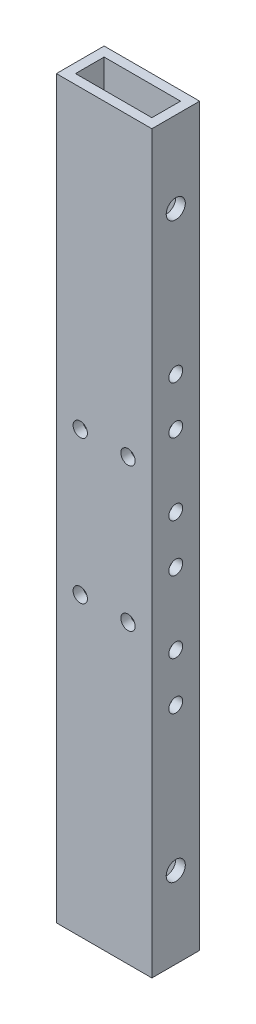
ISO-10303-21;
HEADER;
FILE_DESCRIPTION(('STEP AP214'),'2;1');
FILE_NAME('part.step','',(''),(''),'','','');
FILE_SCHEMA(('AUTOMOTIVE_DESIGN { 1 0 10303 214 1 1 1 1 }'));
ENDSEC;
DATA;
#1=APPLICATION_CONTEXT('core data for automotive mechanical design processes');
#2=APPLICATION_PROTOCOL_DEFINITION('international standard','automotive_design',2000,#1);
#3=PRODUCT_CONTEXT('',#1,'mechanical');
#4=PRODUCT('Part','Part','',(#3));
#5=PRODUCT_RELATED_PRODUCT_CATEGORY('part','',(#4));
#6=PRODUCT_DEFINITION_FORMATION('','',#4);
#7=PRODUCT_DEFINITION_CONTEXT('part definition',#1,'design');
#8=PRODUCT_DEFINITION('design','',#6,#7);
#9=PRODUCT_DEFINITION_SHAPE('','',#8);
#10=(LENGTH_UNIT() NAMED_UNIT(*) SI_UNIT(.MILLI.,.METRE.));
#11=(NAMED_UNIT(*) PLANE_ANGLE_UNIT() SI_UNIT($,.RADIAN.));
#12=(NAMED_UNIT(*) SI_UNIT($,.STERADIAN.) SOLID_ANGLE_UNIT());
#13=UNCERTAINTY_MEASURE_WITH_UNIT(LENGTH_MEASURE(1.E-05),#10,'distance_accuracy_value','');
#14=(GEOMETRIC_REPRESENTATION_CONTEXT(3) GLOBAL_UNCERTAINTY_ASSIGNED_CONTEXT((#13)) GLOBAL_UNIT_ASSIGNED_CONTEXT((#10,
#11,#12)) REPRESENTATION_CONTEXT('',''));
#15=CARTESIAN_POINT('',(0.,0.,0.));
#16=DIRECTION('',(0.,0.,1.));
#17=DIRECTION('',(1.,0.,0.));
#18=AXIS2_PLACEMENT_3D('',#15,#16,#17);
#19=CARTESIAN_POINT('',(0.,77.,0.));
#20=DIRECTION('',(0.,1.,0.));
#21=DIRECTION('',(0.,0.,1.));
#22=AXIS2_PLACEMENT_3D('',#19,#20,#21);
#23=PLANE('',#22);
#24=DIRECTION('',(0.,0.,-1.));
#25=VECTOR('',#24,1.);
#26=CARTESIAN_POINT('',(10.,77.,-5.));
#27=LINE('',#26,#25);
#28=CARTESIAN_POINT('',(10.,77.,5.));
#29=VERTEX_POINT('',#28);
#30=CARTESIAN_POINT('',(10.,77.,-5.));
#31=VERTEX_POINT('',#30);
#32=EDGE_CURVE('E141',#29,#31,#27,.T.);
#33=ORIENTED_EDGE('',*,*,#32,.T.);
#34=DIRECTION('',(-1.,0.,0.));
#35=VECTOR('',#34,1.);
#36=CARTESIAN_POINT('',(-10.,77.,-5.));
#37=LINE('',#36,#35);
#38=CARTESIAN_POINT('',(-10.,77.,-5.));
#39=VERTEX_POINT('',#38);
#40=EDGE_CURVE('E144',#31,#39,#37,.T.);
#41=ORIENTED_EDGE('',*,*,#40,.T.);
#42=DIRECTION('',(0.,0.,1.));
#43=VECTOR('',#42,1.);
#44=CARTESIAN_POINT('',(-10.,77.,-5.));
#45=LINE('',#44,#43);
#46=CARTESIAN_POINT('',(-10.,77.,5.));
#47=VERTEX_POINT('',#46);
#48=EDGE_CURVE('E147',#39,#47,#45,.T.);
#49=ORIENTED_EDGE('',*,*,#48,.T.);
#50=DIRECTION('',(1.,0.,0.));
#51=VECTOR('',#50,1.);
#52=CARTESIAN_POINT('',(-10.,77.,5.));
#53=LINE('',#52,#51);
#54=EDGE_CURVE('E149',#47,#29,#53,.T.);
#55=ORIENTED_EDGE('',*,*,#54,.T.);
#56=EDGE_LOOP('',(#33,#41,#49,#55));
#57=FACE_BOUND('',#56,.T.);
#58=DIRECTION('',(-1.,0.,0.));
#59=VECTOR('',#58,1.);
#60=CARTESIAN_POINT('',(-8.,77.,-3.));
#61=LINE('',#60,#59);
#62=CARTESIAN_POINT('',(8.,77.,-3.));
#63=VERTEX_POINT('',#62);
#64=CARTESIAN_POINT('',(-8.,77.,-3.));
#65=VERTEX_POINT('',#64);
#66=EDGE_CURVE('E111',#63,#65,#61,.T.);
#67=ORIENTED_EDGE('',*,*,#66,.F.);
#68=DIRECTION('',(0.,0.,-1.));
#69=VECTOR('',#68,1.);
#70=CARTESIAN_POINT('',(8.,77.,-3.));
#71=LINE('',#70,#69);
#72=CARTESIAN_POINT('',(8.,77.,3.));
#73=VERTEX_POINT('',#72);
#74=EDGE_CURVE('E103',#73,#63,#71,.T.);
#75=ORIENTED_EDGE('',*,*,#74,.F.);
#76=DIRECTION('',(1.,0.,0.));
#77=VECTOR('',#76,1.);
#78=CARTESIAN_POINT('',(-8.,77.,3.));
#79=LINE('',#78,#77);
#80=CARTESIAN_POINT('',(-8.,77.,3.));
#81=VERTEX_POINT('',#80);
#82=EDGE_CURVE('E125',#81,#73,#79,.T.);
#83=ORIENTED_EDGE('',*,*,#82,.F.);
#84=DIRECTION('',(0.,0.,1.));
#85=VECTOR('',#84,1.);
#86=CARTESIAN_POINT('',(-8.,77.,-3.));
#87=LINE('',#86,#85);
#88=EDGE_CURVE('E123',#65,#81,#87,.T.);
#89=ORIENTED_EDGE('',*,*,#88,.F.);
#90=EDGE_LOOP('',(#67,#75,#83,#89));
#91=FACE_BOUND('',#90,.T.);
#92=ADVANCED_FACE('F36',(#57,#91),#23,.T.);
#93=CARTESIAN_POINT('',(0.,-77.,0.));
#94=DIRECTION('',(0.,1.,0.));
#95=DIRECTION('',(0.,0.,1.));
#96=AXIS2_PLACEMENT_3D('',#93,#94,#95);
#97=PLANE('',#96);
#98=DIRECTION('',(0.,0.,-1.));
#99=VECTOR('',#98,1.);
#100=CARTESIAN_POINT('',(10.,-77.,-5.));
#101=LINE('',#100,#99);
#102=CARTESIAN_POINT('',(10.,-77.,5.));
#103=VERTEX_POINT('',#102);
#104=CARTESIAN_POINT('',(10.,-77.,-5.));
#105=VERTEX_POINT('',#104);
#106=EDGE_CURVE('E119',#103,#105,#101,.T.);
#107=ORIENTED_EDGE('',*,*,#106,.F.);
#108=DIRECTION('',(1.,0.,0.));
#109=VECTOR('',#108,1.);
#110=CARTESIAN_POINT('',(-10.,-77.,5.));
#111=LINE('',#110,#109);
#112=CARTESIAN_POINT('',(-10.,-77.,5.));
#113=VERTEX_POINT('',#112);
#114=EDGE_CURVE('E145',#113,#103,#111,.T.);
#115=ORIENTED_EDGE('',*,*,#114,.F.);
#116=DIRECTION('',(0.,0.,1.));
#117=VECTOR('',#116,1.);
#118=CARTESIAN_POINT('',(-10.,-77.,-5.));
#119=LINE('',#118,#117);
#120=CARTESIAN_POINT('',(-10.,-77.,-5.));
#121=VERTEX_POINT('',#120);
#122=EDGE_CURVE('E156',#121,#113,#119,.T.);
#123=ORIENTED_EDGE('',*,*,#122,.F.);
#124=DIRECTION('',(-1.,0.,0.));
#125=VECTOR('',#124,1.);
#126=CARTESIAN_POINT('',(-10.,-77.,-5.));
#127=LINE('',#126,#125);
#128=EDGE_CURVE('E154',#105,#121,#127,.T.);
#129=ORIENTED_EDGE('',*,*,#128,.F.);
#130=EDGE_LOOP('',(#107,#115,#123,#129));
#131=FACE_BOUND('',#130,.T.);
#132=DIRECTION('',(0.,0.,-1.));
#133=VECTOR('',#132,1.);
#134=CARTESIAN_POINT('',(8.,-77.,-3.));
#135=LINE('',#134,#133);
#136=CARTESIAN_POINT('',(8.,-77.,3.));
#137=VERTEX_POINT('',#136);
#138=CARTESIAN_POINT('',(8.,-77.,-3.));
#139=VERTEX_POINT('',#138);
#140=EDGE_CURVE('E61',#137,#139,#135,.T.);
#141=ORIENTED_EDGE('',*,*,#140,.T.);
#142=DIRECTION('',(-1.,0.,0.));
#143=VECTOR('',#142,1.);
#144=CARTESIAN_POINT('',(-8.,-77.,-3.));
#145=LINE('',#144,#143);
#146=CARTESIAN_POINT('',(-8.,-77.,-3.));
#147=VERTEX_POINT('',#146);
#148=EDGE_CURVE('E118',#139,#147,#145,.T.);
#149=ORIENTED_EDGE('',*,*,#148,.T.);
#150=DIRECTION('',(0.,0.,1.));
#151=VECTOR('',#150,1.);
#152=CARTESIAN_POINT('',(-8.,-77.,-3.));
#153=LINE('',#152,#151);
#154=CARTESIAN_POINT('',(-8.,-77.,3.));
#155=VERTEX_POINT('',#154);
#156=EDGE_CURVE('E133',#147,#155,#153,.T.);
#157=ORIENTED_EDGE('',*,*,#156,.T.);
#158=DIRECTION('',(1.,0.,0.));
#159=VECTOR('',#158,1.);
#160=CARTESIAN_POINT('',(-8.,-77.,3.));
#161=LINE('',#160,#159);
#162=EDGE_CURVE('E112',#155,#137,#161,.T.);
#163=ORIENTED_EDGE('',*,*,#162,.T.);
#164=EDGE_LOOP('',(#141,#149,#157,#163));
#165=FACE_BOUND('',#164,.T.);
#166=ADVANCED_FACE('F319',(#131,#165),#97,.F.);
#167=CARTESIAN_POINT('',(10.,77.,-5.));
#168=DIRECTION('',(-1.,0.,0.));
#169=DIRECTION('',(0.,0.,1.));
#170=AXIS2_PLACEMENT_3D('',#167,#168,#169);
#171=PLANE('',#170);
#172=CARTESIAN_POINT('',(10.,20.,0.));
#173=DIRECTION('',(1.,0.,0.));
#174=DIRECTION('',(0.,0.,-1.));
#175=AXIS2_PLACEMENT_3D('',#172,#173,#174);
#176=CIRCLE('',#175,1.45);
#177=CARTESIAN_POINT('',(10.,20.,-1.45));
#178=VERTEX_POINT('',#177);
#179=EDGE_CURVE('E246',#178,#178,#176,.T.);
#180=ORIENTED_EDGE('',*,*,#179,.F.);
#181=EDGE_LOOP('',(#180));
#182=FACE_BOUND('',#181,.T.);
#183=CARTESIAN_POINT('',(10.,30.,0.));
#184=DIRECTION('',(1.,0.,0.));
#185=DIRECTION('',(0.,0.,-1.));
#186=AXIS2_PLACEMENT_3D('',#183,#184,#185);
#187=CIRCLE('',#186,1.45);
#188=CARTESIAN_POINT('',(10.,30.,-1.45));
#189=VERTEX_POINT('',#188);
#190=EDGE_CURVE('E252',#189,#189,#187,.T.);
#191=ORIENTED_EDGE('',*,*,#190,.F.);
#192=EDGE_LOOP('',(#191));
#193=FACE_BOUND('',#192,.T.);
#194=CARTESIAN_POINT('',(10.,-30.,0.));
#195=DIRECTION('',(1.,0.,0.));
#196=DIRECTION('',(0.,0.,1.));
#197=AXIS2_PLACEMENT_3D('',#194,#195,#196);
#198=CIRCLE('',#197,1.45);
#199=CARTESIAN_POINT('',(10.,-30.,1.45));
#200=VERTEX_POINT('',#199);
#201=EDGE_CURVE('E258',#200,#200,#198,.T.);
#202=ORIENTED_EDGE('',*,*,#201,.F.);
#203=EDGE_LOOP('',(#202));
#204=FACE_BOUND('',#203,.T.);
#205=CARTESIAN_POINT('',(10.,-20.,0.));
#206=DIRECTION('',(1.,0.,0.));
#207=DIRECTION('',(0.,0.,1.));
#208=AXIS2_PLACEMENT_3D('',#205,#206,#207);
#209=CIRCLE('',#208,1.45);
#210=CARTESIAN_POINT('',(10.,-20.,1.45));
#211=VERTEX_POINT('',#210);
#212=EDGE_CURVE('E227',#211,#211,#209,.T.);
#213=ORIENTED_EDGE('',*,*,#212,.F.);
#214=EDGE_LOOP('',(#213));
#215=FACE_BOUND('',#214,.T.);
#216=CARTESIAN_POINT('',(10.,-5.,0.));
#217=DIRECTION('',(1.,0.,0.));
#218=DIRECTION('',(0.,0.,1.));
#219=AXIS2_PLACEMENT_3D('',#216,#217,#218);
#220=CIRCLE('',#219,1.45);
#221=CARTESIAN_POINT('',(10.,-5.,1.45));
#222=VERTEX_POINT('',#221);
#223=EDGE_CURVE('E228',#222,#222,#220,.T.);
#224=ORIENTED_EDGE('',*,*,#223,.F.);
#225=EDGE_LOOP('',(#224));
#226=FACE_BOUND('',#225,.T.);
#227=CARTESIAN_POINT('',(10.,60.,0.));
#228=DIRECTION('',(1.,0.,0.));
#229=DIRECTION('',(0.,0.,-1.));
#230=AXIS2_PLACEMENT_3D('',#227,#228,#229);
#231=CIRCLE('',#230,2.);
#232=CARTESIAN_POINT('',(10.,60.,-1.99999999999999));
#233=VERTEX_POINT('',#232);
#234=EDGE_CURVE('E234',#233,#233,#231,.T.);
#235=ORIENTED_EDGE('',*,*,#234,.F.);
#236=EDGE_LOOP('',(#235));
#237=FACE_BOUND('',#236,.T.);
#238=CARTESIAN_POINT('',(10.,-60.,0.));
#239=DIRECTION('',(1.,0.,0.));
#240=DIRECTION('',(0.,0.,1.));
#241=AXIS2_PLACEMENT_3D('',#238,#239,#240);
#242=CIRCLE('',#241,2.);
#243=CARTESIAN_POINT('',(10.,-60.,1.99999999999999));
#244=VERTEX_POINT('',#243);
#245=EDGE_CURVE('E223',#244,#244,#242,.T.);
#246=ORIENTED_EDGE('',*,*,#245,.F.);
#247=EDGE_LOOP('',(#246));
#248=FACE_BOUND('',#247,.T.);
#249=CARTESIAN_POINT('',(10.,5.,0.));
#250=DIRECTION('',(1.,0.,0.));
#251=DIRECTION('',(0.,0.,-1.));
#252=AXIS2_PLACEMENT_3D('',#249,#250,#251);
#253=CIRCLE('',#252,1.45);
#254=CARTESIAN_POINT('',(10.,5.,-1.45));
#255=VERTEX_POINT('',#254);
#256=EDGE_CURVE('E245',#255,#255,#253,.T.);
#257=ORIENTED_EDGE('',*,*,#256,.F.);
#258=EDGE_LOOP('',(#257));
#259=FACE_BOUND('',#258,.T.);
#260=ORIENTED_EDGE('',*,*,#106,.T.);
#261=DIRECTION('',(0.,-1.,0.));
#262=VECTOR('',#261,1.);
#263=CARTESIAN_POINT('',(10.,77.,-5.));
#264=LINE('',#263,#262);
#265=EDGE_CURVE('E11',#31,#105,#264,.T.);
#266=ORIENTED_EDGE('',*,*,#265,.F.);
#267=ORIENTED_EDGE('',*,*,#32,.F.);
#268=DIRECTION('',(0.,-1.,0.));
#269=VECTOR('',#268,1.);
#270=CARTESIAN_POINT('',(10.,77.,5.));
#271=LINE('',#270,#269);
#272=EDGE_CURVE('E151',#29,#103,#271,.T.);
#273=ORIENTED_EDGE('',*,*,#272,.T.);
#274=EDGE_LOOP('',(#260,#266,#267,#273));
#275=FACE_BOUND('',#274,.T.);
#276=ADVANCED_FACE('F38',(#182,#193,#204,#215,#226,#237,#248,#259,#275),#171,.F.);
#277=CARTESIAN_POINT('',(-10.,77.,-5.));
#278=DIRECTION('',(0.,0.,1.));
#279=DIRECTION('',(1.,0.,0.));
#280=AXIS2_PLACEMENT_3D('',#277,#278,#279);
#281=PLANE('',#280);
#282=CARTESIAN_POINT('',(5.,-14.9999999999998,-5.));
#283=DIRECTION('',(0.,0.,-1.));
#284=DIRECTION('',(-1.,0.,0.));
#285=AXIS2_PLACEMENT_3D('',#282,#283,#284);
#286=CIRCLE('',#285,1.5);
#287=CARTESIAN_POINT('',(3.5,-14.9999999999998,-5.));
#288=VERTEX_POINT('',#287);
#289=EDGE_CURVE('E444',#288,#288,#286,.T.);
#290=ORIENTED_EDGE('',*,*,#289,.F.);
#291=EDGE_LOOP('',(#290));
#292=FACE_BOUND('',#291,.T.);
#293=CARTESIAN_POINT('',(-5.,14.9999999999998,-5.));
#294=DIRECTION('',(0.,0.,-1.));
#295=DIRECTION('',(1.,0.,0.));
#296=AXIS2_PLACEMENT_3D('',#293,#294,#295);
#297=CIRCLE('',#296,1.5);
#298=CARTESIAN_POINT('',(-3.5,14.9999999999998,-5.));
#299=VERTEX_POINT('',#298);
#300=EDGE_CURVE('E437',#299,#299,#297,.T.);
#301=ORIENTED_EDGE('',*,*,#300,.F.);
#302=EDGE_LOOP('',(#301));
#303=FACE_BOUND('',#302,.T.);
#304=CARTESIAN_POINT('',(5.,14.9999999999998,-5.));
#305=DIRECTION('',(0.,0.,-1.));
#306=DIRECTION('',(1.,0.,0.));
#307=AXIS2_PLACEMENT_3D('',#304,#305,#306);
#308=CIRCLE('',#307,1.5);
#309=CARTESIAN_POINT('',(6.5,14.9999999999998,-5.));
#310=VERTEX_POINT('',#309);
#311=EDGE_CURVE('E432',#310,#310,#308,.T.);
#312=ORIENTED_EDGE('',*,*,#311,.F.);
#313=EDGE_LOOP('',(#312));
#314=FACE_BOUND('',#313,.T.);
#315=CARTESIAN_POINT('',(-5.,-14.9999999999998,-5.));
#316=DIRECTION('',(0.,0.,-1.));
#317=DIRECTION('',(-1.,0.,0.));
#318=AXIS2_PLACEMENT_3D('',#315,#316,#317);
#319=CIRCLE('',#318,1.5);
#320=CARTESIAN_POINT('',(-6.5,-14.9999999999998,-5.));
#321=VERTEX_POINT('',#320);
#322=EDGE_CURVE('E443',#321,#321,#319,.T.);
#323=ORIENTED_EDGE('',*,*,#322,.F.);
#324=EDGE_LOOP('',(#323));
#325=FACE_BOUND('',#324,.T.);
#326=ORIENTED_EDGE('',*,*,#128,.T.);
#327=DIRECTION('',(0.,-1.,0.));
#328=VECTOR('',#327,1.);
#329=CARTESIAN_POINT('',(-10.,77.,-5.));
#330=LINE('',#329,#328);
#331=EDGE_CURVE('E45',#39,#121,#330,.T.);
#332=ORIENTED_EDGE('',*,*,#331,.F.);
#333=ORIENTED_EDGE('',*,*,#40,.F.);
#334=ORIENTED_EDGE('',*,*,#265,.T.);
#335=EDGE_LOOP('',(#326,#332,#333,#334));
#336=FACE_BOUND('',#335,.T.);
#337=ADVANCED_FACE('F318',(#292,#303,#314,#325,#336),#281,.F.);
#338=CARTESIAN_POINT('',(-10.,77.,-5.));
#339=DIRECTION('',(1.,0.,0.));
#340=DIRECTION('',(0.,0.,-1.));
#341=AXIS2_PLACEMENT_3D('',#338,#339,#340);
#342=PLANE('',#341);
#343=CARTESIAN_POINT('',(-10.,20.,0.));
#344=DIRECTION('',(1.,0.,0.));
#345=DIRECTION('',(0.,0.,-1.));
#346=AXIS2_PLACEMENT_3D('',#343,#344,#345);
#347=CIRCLE('',#346,1.45);
#348=CARTESIAN_POINT('',(-10.,20.,-1.45));
#349=VERTEX_POINT('',#348);
#350=EDGE_CURVE('E242',#349,#349,#347,.T.);
#351=ORIENTED_EDGE('',*,*,#350,.T.);
#352=EDGE_LOOP('',(#351));
#353=FACE_BOUND('',#352,.T.);
#354=CARTESIAN_POINT('',(-10.,30.,0.));
#355=DIRECTION('',(1.,0.,0.));
#356=DIRECTION('',(0.,0.,-1.));
#357=AXIS2_PLACEMENT_3D('',#354,#355,#356);
#358=CIRCLE('',#357,1.45);
#359=CARTESIAN_POINT('',(-10.,30.,-1.45));
#360=VERTEX_POINT('',#359);
#361=EDGE_CURVE('E249',#360,#360,#358,.T.);
#362=ORIENTED_EDGE('',*,*,#361,.T.);
#363=EDGE_LOOP('',(#362));
#364=FACE_BOUND('',#363,.T.);
#365=CARTESIAN_POINT('',(-10.,-30.,0.));
#366=DIRECTION('',(1.,0.,0.));
#367=DIRECTION('',(0.,0.,1.));
#368=AXIS2_PLACEMENT_3D('',#365,#366,#367);
#369=CIRCLE('',#368,1.45);
#370=CARTESIAN_POINT('',(-10.,-30.,1.45));
#371=VERTEX_POINT('',#370);
#372=EDGE_CURVE('E255',#371,#371,#369,.T.);
#373=ORIENTED_EDGE('',*,*,#372,.T.);
#374=EDGE_LOOP('',(#373));
#375=FACE_BOUND('',#374,.T.);
#376=CARTESIAN_POINT('',(-10.,-20.,0.));
#377=DIRECTION('',(1.,0.,0.));
#378=DIRECTION('',(0.,0.,1.));
#379=AXIS2_PLACEMENT_3D('',#376,#377,#378);
#380=CIRCLE('',#379,1.45);
#381=CARTESIAN_POINT('',(-10.,-20.,1.45));
#382=VERTEX_POINT('',#381);
#383=EDGE_CURVE('E261',#382,#382,#380,.T.);
#384=ORIENTED_EDGE('',*,*,#383,.T.);
#385=EDGE_LOOP('',(#384));
#386=FACE_BOUND('',#385,.T.);
#387=CARTESIAN_POINT('',(-10.,-5.,0.));
#388=DIRECTION('',(1.,0.,0.));
#389=DIRECTION('',(0.,0.,1.));
#390=AXIS2_PLACEMENT_3D('',#387,#388,#389);
#391=CIRCLE('',#390,1.45);
#392=CARTESIAN_POINT('',(-10.,-5.,1.45));
#393=VERTEX_POINT('',#392);
#394=EDGE_CURVE('E224',#393,#393,#391,.T.);
#395=ORIENTED_EDGE('',*,*,#394,.T.);
#396=EDGE_LOOP('',(#395));
#397=FACE_BOUND('',#396,.T.);
#398=CARTESIAN_POINT('',(-10.,60.,0.));
#399=DIRECTION('',(1.,0.,0.));
#400=DIRECTION('',(0.,0.,-1.));
#401=AXIS2_PLACEMENT_3D('',#398,#399,#400);
#402=CIRCLE('',#401,2.);
#403=CARTESIAN_POINT('',(-10.,60.,-1.99999999999999));
#404=VERTEX_POINT('',#403);
#405=EDGE_CURVE('E231',#404,#404,#402,.T.);
#406=ORIENTED_EDGE('',*,*,#405,.T.);
#407=EDGE_LOOP('',(#406));
#408=FACE_BOUND('',#407,.T.);
#409=CARTESIAN_POINT('',(-10.,-60.,0.));
#410=DIRECTION('',(1.,0.,0.));
#411=DIRECTION('',(0.,0.,1.));
#412=AXIS2_PLACEMENT_3D('',#409,#410,#411);
#413=CIRCLE('',#412,2.);
#414=CARTESIAN_POINT('',(-10.,-60.,1.99999999999999));
#415=VERTEX_POINT('',#414);
#416=EDGE_CURVE('E237',#415,#415,#413,.T.);
#417=ORIENTED_EDGE('',*,*,#416,.T.);
#418=EDGE_LOOP('',(#417));
#419=FACE_BOUND('',#418,.T.);
#420=CARTESIAN_POINT('',(-10.,5.,0.));
#421=DIRECTION('',(1.,0.,0.));
#422=DIRECTION('',(0.,0.,-1.));
#423=AXIS2_PLACEMENT_3D('',#420,#421,#422);
#424=CIRCLE('',#423,1.45);
#425=CARTESIAN_POINT('',(-10.,5.,-1.45));
#426=VERTEX_POINT('',#425);
#427=EDGE_CURVE('E170',#426,#426,#424,.T.);
#428=ORIENTED_EDGE('',*,*,#427,.T.);
#429=EDGE_LOOP('',(#428));
#430=FACE_BOUND('',#429,.T.);
#431=ORIENTED_EDGE('',*,*,#122,.T.);
#432=DIRECTION('',(0.,-1.,0.));
#433=VECTOR('',#432,1.);
#434=CARTESIAN_POINT('',(-10.,77.,5.));
#435=LINE('',#434,#433);
#436=EDGE_CURVE('E161',#47,#113,#435,.T.);
#437=ORIENTED_EDGE('',*,*,#436,.F.);
#438=ORIENTED_EDGE('',*,*,#48,.F.);
#439=ORIENTED_EDGE('',*,*,#331,.T.);
#440=EDGE_LOOP('',(#431,#437,#438,#439));
#441=FACE_BOUND('',#440,.T.);
#442=ADVANCED_FACE('F337',(#353,#364,#375,#386,#397,#408,#419,#430,#441),#342,.F.);
#443=CARTESIAN_POINT('',(-10.,77.,5.));
#444=DIRECTION('',(0.,0.,-1.));
#445=DIRECTION('',(-1.,0.,0.));
#446=AXIS2_PLACEMENT_3D('',#443,#444,#445);
#447=PLANE('',#446);
#448=CARTESIAN_POINT('',(5.,-14.9999999999998,5.));
#449=DIRECTION('',(0.,0.,-1.));
#450=DIRECTION('',(-1.,0.,0.));
#451=AXIS2_PLACEMENT_3D('',#448,#449,#450);
#452=CIRCLE('',#451,1.5);
#453=CARTESIAN_POINT('',(3.5,-14.9999999999998,5.));
#454=VERTEX_POINT('',#453);
#455=EDGE_CURVE('E440',#454,#454,#452,.T.);
#456=ORIENTED_EDGE('',*,*,#455,.T.);
#457=EDGE_LOOP('',(#456));
#458=FACE_BOUND('',#457,.T.);
#459=CARTESIAN_POINT('',(-5.,14.9999999999998,5.));
#460=DIRECTION('',(0.,0.,-1.));
#461=DIRECTION('',(1.,0.,0.));
#462=AXIS2_PLACEMENT_3D('',#459,#460,#461);
#463=CIRCLE('',#462,1.5);
#464=CARTESIAN_POINT('',(-3.5,14.9999999999998,5.));
#465=VERTEX_POINT('',#464);
#466=EDGE_CURVE('E447',#465,#465,#463,.T.);
#467=ORIENTED_EDGE('',*,*,#466,.T.);
#468=EDGE_LOOP('',(#467));
#469=FACE_BOUND('',#468,.T.);
#470=CARTESIAN_POINT('',(5.,14.9999999999998,5.));
#471=DIRECTION('',(0.,0.,-1.));
#472=DIRECTION('',(1.,0.,0.));
#473=AXIS2_PLACEMENT_3D('',#470,#471,#472);
#474=CIRCLE('',#473,1.5);
#475=CARTESIAN_POINT('',(6.5,14.9999999999998,5.));
#476=VERTEX_POINT('',#475);
#477=EDGE_CURVE('E434',#476,#476,#474,.T.);
#478=ORIENTED_EDGE('',*,*,#477,.T.);
#479=EDGE_LOOP('',(#478));
#480=FACE_BOUND('',#479,.T.);
#481=CARTESIAN_POINT('',(-5.,-14.9999999999998,5.));
#482=DIRECTION('',(0.,0.,-1.));
#483=DIRECTION('',(-1.,0.,0.));
#484=AXIS2_PLACEMENT_3D('',#481,#482,#483);
#485=CIRCLE('',#484,1.5);
#486=CARTESIAN_POINT('',(-6.5,-14.9999999999998,5.));
#487=VERTEX_POINT('',#486);
#488=EDGE_CURVE('E202',#487,#487,#485,.T.);
#489=ORIENTED_EDGE('',*,*,#488,.T.);
#490=EDGE_LOOP('',(#489));
#491=FACE_BOUND('',#490,.T.);
#492=ORIENTED_EDGE('',*,*,#114,.T.);
#493=ORIENTED_EDGE('',*,*,#272,.F.);
#494=ORIENTED_EDGE('',*,*,#54,.F.);
#495=ORIENTED_EDGE('',*,*,#436,.T.);
#496=EDGE_LOOP('',(#492,#493,#494,#495));
#497=FACE_BOUND('',#496,.T.);
#498=ADVANCED_FACE('F291',(#458,#469,#480,#491,#497),#447,.F.);
#499=CARTESIAN_POINT('',(8.,77.,-3.));
#500=DIRECTION('',(-1.,0.,0.));
#501=DIRECTION('',(0.,0.,1.));
#502=AXIS2_PLACEMENT_3D('',#499,#500,#501);
#503=PLANE('',#502);
#504=CARTESIAN_POINT('',(8.,20.,0.));
#505=DIRECTION('',(-1.,0.,0.));
#506=DIRECTION('',(0.,0.,1.));
#507=AXIS2_PLACEMENT_3D('',#504,#505,#506);
#508=CIRCLE('',#507,1.45);
#509=CARTESIAN_POINT('',(8.,20.,1.45));
#510=VERTEX_POINT('',#509);
#511=EDGE_CURVE('E131',#510,#510,#508,.T.);
#512=ORIENTED_EDGE('',*,*,#511,.F.);
#513=EDGE_LOOP('',(#512));
#514=FACE_BOUND('',#513,.T.);
#515=CARTESIAN_POINT('',(8.,30.,0.));
#516=DIRECTION('',(-1.,0.,0.));
#517=DIRECTION('',(0.,0.,1.));
#518=AXIS2_PLACEMENT_3D('',#515,#516,#517);
#519=CIRCLE('',#518,1.45);
#520=CARTESIAN_POINT('',(8.,30.,1.45));
#521=VERTEX_POINT('',#520);
#522=EDGE_CURVE('E194',#521,#521,#519,.T.);
#523=ORIENTED_EDGE('',*,*,#522,.F.);
#524=EDGE_LOOP('',(#523));
#525=FACE_BOUND('',#524,.T.);
#526=CARTESIAN_POINT('',(8.,-30.,0.));
#527=DIRECTION('',(-1.,0.,0.));
#528=DIRECTION('',(0.,0.,1.));
#529=AXIS2_PLACEMENT_3D('',#526,#527,#528);
#530=CIRCLE('',#529,1.45);
#531=CARTESIAN_POINT('',(8.,-30.,1.45));
#532=VERTEX_POINT('',#531);
#533=EDGE_CURVE('E190',#532,#532,#530,.T.);
#534=ORIENTED_EDGE('',*,*,#533,.F.);
#535=EDGE_LOOP('',(#534));
#536=FACE_BOUND('',#535,.T.);
#537=CARTESIAN_POINT('',(8.,-20.,0.));
#538=DIRECTION('',(-1.,0.,0.));
#539=DIRECTION('',(0.,0.,1.));
#540=AXIS2_PLACEMENT_3D('',#537,#538,#539);
#541=CIRCLE('',#540,1.45);
#542=CARTESIAN_POINT('',(8.,-20.,1.45));
#543=VERTEX_POINT('',#542);
#544=EDGE_CURVE('E186',#543,#543,#541,.T.);
#545=ORIENTED_EDGE('',*,*,#544,.F.);
#546=EDGE_LOOP('',(#545));
#547=FACE_BOUND('',#546,.T.);
#548=CARTESIAN_POINT('',(8.,-5.,0.));
#549=DIRECTION('',(-1.,0.,0.));
#550=DIRECTION('',(0.,0.,1.));
#551=AXIS2_PLACEMENT_3D('',#548,#549,#550);
#552=CIRCLE('',#551,1.45);
#553=CARTESIAN_POINT('',(8.,-5.,1.45));
#554=VERTEX_POINT('',#553);
#555=EDGE_CURVE('E182',#554,#554,#552,.T.);
#556=ORIENTED_EDGE('',*,*,#555,.F.);
#557=EDGE_LOOP('',(#556));
#558=FACE_BOUND('',#557,.T.);
#559=CARTESIAN_POINT('',(8.,60.,0.));
#560=DIRECTION('',(-1.,0.,0.));
#561=DIRECTION('',(0.,0.,1.));
#562=AXIS2_PLACEMENT_3D('',#559,#560,#561);
#563=CIRCLE('',#562,2.);
#564=CARTESIAN_POINT('',(8.,60.,2.00000000000001));
#565=VERTEX_POINT('',#564);
#566=EDGE_CURVE('E178',#565,#565,#563,.T.);
#567=ORIENTED_EDGE('',*,*,#566,.F.);
#568=EDGE_LOOP('',(#567));
#569=FACE_BOUND('',#568,.T.);
#570=CARTESIAN_POINT('',(8.,-60.,0.));
#571=DIRECTION('',(-1.,0.,0.));
#572=DIRECTION('',(0.,0.,1.));
#573=AXIS2_PLACEMENT_3D('',#570,#571,#572);
#574=CIRCLE('',#573,2.);
#575=CARTESIAN_POINT('',(8.,-60.,1.99999999999999));
#576=VERTEX_POINT('',#575);
#577=EDGE_CURVE('E174',#576,#576,#574,.T.);
#578=ORIENTED_EDGE('',*,*,#577,.F.);
#579=EDGE_LOOP('',(#578));
#580=FACE_BOUND('',#579,.T.);
#581=CARTESIAN_POINT('',(8.,5.,0.));
#582=DIRECTION('',(-1.,0.,0.));
#583=DIRECTION('',(0.,0.,1.));
#584=AXIS2_PLACEMENT_3D('',#581,#582,#583);
#585=CIRCLE('',#584,1.45);
#586=CARTESIAN_POINT('',(8.,5.,1.45));
#587=VERTEX_POINT('',#586);
#588=EDGE_CURVE('E169',#587,#587,#585,.T.);
#589=ORIENTED_EDGE('',*,*,#588,.F.);
#590=EDGE_LOOP('',(#589));
#591=FACE_BOUND('',#590,.T.);
#592=ORIENTED_EDGE('',*,*,#140,.F.);
#593=DIRECTION('',(0.,-1.,0.));
#594=VECTOR('',#593,1.);
#595=CARTESIAN_POINT('',(8.,77.,3.));
#596=LINE('',#595,#594);
#597=EDGE_CURVE('E107',#73,#137,#596,.T.);
#598=ORIENTED_EDGE('',*,*,#597,.F.);
#599=ORIENTED_EDGE('',*,*,#74,.T.);
#600=DIRECTION('',(0.,-1.,0.));
#601=VECTOR('',#600,1.);
#602=CARTESIAN_POINT('',(8.,77.,-3.));
#603=LINE('',#602,#601);
#604=EDGE_CURVE('E106',#63,#139,#603,.T.);
#605=ORIENTED_EDGE('',*,*,#604,.T.);
#606=EDGE_LOOP('',(#592,#598,#599,#605));
#607=FACE_BOUND('',#606,.T.);
#608=ADVANCED_FACE('F105',(#514,#525,#536,#547,#558,#569,#580,#591,#607),#503,.T.);
#609=CARTESIAN_POINT('',(-8.,77.,-3.));
#610=DIRECTION('',(0.,0.,1.));
#611=DIRECTION('',(1.,0.,0.));
#612=AXIS2_PLACEMENT_3D('',#609,#610,#611);
#613=PLANE('',#612);
#614=CARTESIAN_POINT('',(5.,-14.9999999999998,-3.));
#615=DIRECTION('',(0.,0.,1.));
#616=DIRECTION('',(1.,0.,0.));
#617=AXIS2_PLACEMENT_3D('',#614,#615,#616);
#618=CIRCLE('',#617,1.5);
#619=CARTESIAN_POINT('',(6.5,-14.9999999999998,-3.));
#620=VERTEX_POINT('',#619);
#621=EDGE_CURVE('E220',#620,#620,#618,.T.);
#622=ORIENTED_EDGE('',*,*,#621,.F.);
#623=EDGE_LOOP('',(#622));
#624=FACE_BOUND('',#623,.T.);
#625=CARTESIAN_POINT('',(-5.,14.9999999999998,-3.));
#626=DIRECTION('',(0.,0.,1.));
#627=DIRECTION('',(1.,0.,0.));
#628=AXIS2_PLACEMENT_3D('',#625,#626,#627);
#629=CIRCLE('',#628,1.5);
#630=CARTESIAN_POINT('',(-3.5,14.9999999999998,-3.));
#631=VERTEX_POINT('',#630);
#632=EDGE_CURVE('E208',#631,#631,#629,.T.);
#633=ORIENTED_EDGE('',*,*,#632,.F.);
#634=EDGE_LOOP('',(#633));
#635=FACE_BOUND('',#634,.T.);
#636=CARTESIAN_POINT('',(5.,14.9999999999998,-3.));
#637=DIRECTION('',(0.,0.,1.));
#638=DIRECTION('',(1.,0.,0.));
#639=AXIS2_PLACEMENT_3D('',#636,#637,#638);
#640=CIRCLE('',#639,1.5);
#641=CARTESIAN_POINT('',(6.5,14.9999999999998,-3.));
#642=VERTEX_POINT('',#641);
#643=EDGE_CURVE('E205',#642,#642,#640,.T.);
#644=ORIENTED_EDGE('',*,*,#643,.F.);
#645=EDGE_LOOP('',(#644));
#646=FACE_BOUND('',#645,.T.);
#647=CARTESIAN_POINT('',(-5.,-14.9999999999998,-3.));
#648=DIRECTION('',(0.,0.,1.));
#649=DIRECTION('',(1.,0.,0.));
#650=AXIS2_PLACEMENT_3D('',#647,#648,#649);
#651=CIRCLE('',#650,1.5);
#652=CARTESIAN_POINT('',(-3.5,-14.9999999999998,-3.));
#653=VERTEX_POINT('',#652);
#654=EDGE_CURVE('E201',#653,#653,#651,.T.);
#655=ORIENTED_EDGE('',*,*,#654,.F.);
#656=EDGE_LOOP('',(#655));
#657=FACE_BOUND('',#656,.T.);
#658=ORIENTED_EDGE('',*,*,#148,.F.);
#659=ORIENTED_EDGE('',*,*,#604,.F.);
#660=ORIENTED_EDGE('',*,*,#66,.T.);
#661=DIRECTION('',(0.,-1.,0.));
#662=VECTOR('',#661,1.);
#663=CARTESIAN_POINT('',(-8.,77.,-3.));
#664=LINE('',#663,#662);
#665=EDGE_CURVE('E120',#65,#147,#664,.T.);
#666=ORIENTED_EDGE('',*,*,#665,.T.);
#667=EDGE_LOOP('',(#658,#659,#660,#666));
#668=FACE_BOUND('',#667,.T.);
#669=ADVANCED_FACE('F115',(#624,#635,#646,#657,#668),#613,.T.);
#670=CARTESIAN_POINT('',(-8.,77.,-3.));
#671=DIRECTION('',(1.,0.,0.));
#672=DIRECTION('',(0.,0.,-1.));
#673=AXIS2_PLACEMENT_3D('',#670,#671,#672);
#674=PLANE('',#673);
#675=CARTESIAN_POINT('',(-8.,20.,0.));
#676=DIRECTION('',(1.,0.,0.));
#677=DIRECTION('',(0.,0.,-1.));
#678=AXIS2_PLACEMENT_3D('',#675,#676,#677);
#679=CIRCLE('',#678,1.45);
#680=CARTESIAN_POINT('',(-8.,20.,-1.45));
#681=VERTEX_POINT('',#680);
#682=EDGE_CURVE('E195',#681,#681,#679,.T.);
#683=ORIENTED_EDGE('',*,*,#682,.F.);
#684=EDGE_LOOP('',(#683));
#685=FACE_BOUND('',#684,.T.);
#686=CARTESIAN_POINT('',(-8.,30.,0.));
#687=DIRECTION('',(1.,0.,0.));
#688=DIRECTION('',(0.,0.,-1.));
#689=AXIS2_PLACEMENT_3D('',#686,#687,#688);
#690=CIRCLE('',#689,1.45);
#691=CARTESIAN_POINT('',(-8.,30.,-1.45));
#692=VERTEX_POINT('',#691);
#693=EDGE_CURVE('E191',#692,#692,#690,.T.);
#694=ORIENTED_EDGE('',*,*,#693,.F.);
#695=EDGE_LOOP('',(#694));
#696=FACE_BOUND('',#695,.T.);
#697=CARTESIAN_POINT('',(-8.,-30.,0.));
#698=DIRECTION('',(1.,0.,0.));
#699=DIRECTION('',(0.,0.,-1.));
#700=AXIS2_PLACEMENT_3D('',#697,#698,#699);
#701=CIRCLE('',#700,1.45);
#702=CARTESIAN_POINT('',(-8.,-30.,-1.45));
#703=VERTEX_POINT('',#702);
#704=EDGE_CURVE('E187',#703,#703,#701,.T.);
#705=ORIENTED_EDGE('',*,*,#704,.F.);
#706=EDGE_LOOP('',(#705));
#707=FACE_BOUND('',#706,.T.);
#708=CARTESIAN_POINT('',(-8.,-20.,0.));
#709=DIRECTION('',(1.,0.,0.));
#710=DIRECTION('',(0.,0.,-1.));
#711=AXIS2_PLACEMENT_3D('',#708,#709,#710);
#712=CIRCLE('',#711,1.45);
#713=CARTESIAN_POINT('',(-8.,-20.,-1.45));
#714=VERTEX_POINT('',#713);
#715=EDGE_CURVE('E183',#714,#714,#712,.T.);
#716=ORIENTED_EDGE('',*,*,#715,.F.);
#717=EDGE_LOOP('',(#716));
#718=FACE_BOUND('',#717,.T.);
#719=CARTESIAN_POINT('',(-8.,-5.,0.));
#720=DIRECTION('',(1.,0.,0.));
#721=DIRECTION('',(0.,0.,-1.));
#722=AXIS2_PLACEMENT_3D('',#719,#720,#721);
#723=CIRCLE('',#722,1.45);
#724=CARTESIAN_POINT('',(-8.,-5.,-1.45));
#725=VERTEX_POINT('',#724);
#726=EDGE_CURVE('E179',#725,#725,#723,.T.);
#727=ORIENTED_EDGE('',*,*,#726,.F.);
#728=EDGE_LOOP('',(#727));
#729=FACE_BOUND('',#728,.T.);
#730=CARTESIAN_POINT('',(-8.,60.,0.));
#731=DIRECTION('',(1.,0.,0.));
#732=DIRECTION('',(0.,0.,-1.));
#733=AXIS2_PLACEMENT_3D('',#730,#731,#732);
#734=CIRCLE('',#733,2.);
#735=CARTESIAN_POINT('',(-8.,60.,-1.99999999999999));
#736=VERTEX_POINT('',#735);
#737=EDGE_CURVE('E175',#736,#736,#734,.T.);
#738=ORIENTED_EDGE('',*,*,#737,.F.);
#739=EDGE_LOOP('',(#738));
#740=FACE_BOUND('',#739,.T.);
#741=CARTESIAN_POINT('',(-8.,-60.,0.));
#742=DIRECTION('',(1.,0.,0.));
#743=DIRECTION('',(0.,0.,-1.));
#744=AXIS2_PLACEMENT_3D('',#741,#742,#743);
#745=CIRCLE('',#744,2.);
#746=CARTESIAN_POINT('',(-8.,-60.,-2.00000000000001));
#747=VERTEX_POINT('',#746);
#748=EDGE_CURVE('E171',#747,#747,#745,.T.);
#749=ORIENTED_EDGE('',*,*,#748,.F.);
#750=EDGE_LOOP('',(#749));
#751=FACE_BOUND('',#750,.T.);
#752=CARTESIAN_POINT('',(-8.,5.,0.));
#753=DIRECTION('',(1.,0.,0.));
#754=DIRECTION('',(0.,0.,-1.));
#755=AXIS2_PLACEMENT_3D('',#752,#753,#754);
#756=CIRCLE('',#755,1.45);
#757=CARTESIAN_POINT('',(-8.,5.,-1.45));
#758=VERTEX_POINT('',#757);
#759=EDGE_CURVE('E166',#758,#758,#756,.T.);
#760=ORIENTED_EDGE('',*,*,#759,.F.);
#761=EDGE_LOOP('',(#760));
#762=FACE_BOUND('',#761,.T.);
#763=ORIENTED_EDGE('',*,*,#156,.F.);
#764=ORIENTED_EDGE('',*,*,#665,.F.);
#765=ORIENTED_EDGE('',*,*,#88,.T.);
#766=DIRECTION('',(0.,-1.,0.));
#767=VECTOR('',#766,1.);
#768=CARTESIAN_POINT('',(-8.,77.,3.));
#769=LINE('',#768,#767);
#770=EDGE_CURVE('E53',#81,#155,#769,.T.);
#771=ORIENTED_EDGE('',*,*,#770,.T.);
#772=EDGE_LOOP('',(#763,#764,#765,#771));
#773=FACE_BOUND('',#772,.T.);
#774=ADVANCED_FACE('F358',(#685,#696,#707,#718,#729,#740,#751,#762,#773),#674,.T.);
#775=CARTESIAN_POINT('',(-8.,77.,3.));
#776=DIRECTION('',(0.,0.,-1.));
#777=DIRECTION('',(-1.,0.,0.));
#778=AXIS2_PLACEMENT_3D('',#775,#776,#777);
#779=PLANE('',#778);
#780=CARTESIAN_POINT('',(5.,-14.9999999999998,3.));
#781=DIRECTION('',(0.,0.,-1.));
#782=DIRECTION('',(-1.,0.,0.));
#783=AXIS2_PLACEMENT_3D('',#780,#781,#782);
#784=CIRCLE('',#783,1.5);
#785=CARTESIAN_POINT('',(3.5,-14.9999999999998,3.));
#786=VERTEX_POINT('',#785);
#787=EDGE_CURVE('E40',#786,#786,#784,.T.);
#788=ORIENTED_EDGE('',*,*,#787,.F.);
#789=EDGE_LOOP('',(#788));
#790=FACE_BOUND('',#789,.T.);
#791=CARTESIAN_POINT('',(-5.,14.9999999999998,3.));
#792=DIRECTION('',(0.,0.,-1.));
#793=DIRECTION('',(-1.,0.,0.));
#794=AXIS2_PLACEMENT_3D('',#791,#792,#793);
#795=CIRCLE('',#794,1.5);
#796=CARTESIAN_POINT('',(-6.5,14.9999999999998,3.));
#797=VERTEX_POINT('',#796);
#798=EDGE_CURVE('E206',#797,#797,#795,.T.);
#799=ORIENTED_EDGE('',*,*,#798,.F.);
#800=EDGE_LOOP('',(#799));
#801=FACE_BOUND('',#800,.T.);
#802=CARTESIAN_POINT('',(5.,14.9999999999998,3.));
#803=DIRECTION('',(0.,0.,-1.));
#804=DIRECTION('',(-1.,0.,0.));
#805=AXIS2_PLACEMENT_3D('',#802,#803,#804);
#806=CIRCLE('',#805,1.5);
#807=CARTESIAN_POINT('',(3.5,14.9999999999998,3.));
#808=VERTEX_POINT('',#807);
#809=EDGE_CURVE('E203',#808,#808,#806,.T.);
#810=ORIENTED_EDGE('',*,*,#809,.F.);
#811=EDGE_LOOP('',(#810));
#812=FACE_BOUND('',#811,.T.);
#813=CARTESIAN_POINT('',(-5.,-14.9999999999998,3.));
#814=DIRECTION('',(0.,0.,-1.));
#815=DIRECTION('',(-1.,0.,0.));
#816=AXIS2_PLACEMENT_3D('',#813,#814,#815);
#817=CIRCLE('',#816,1.5);
#818=CARTESIAN_POINT('',(-6.5,-14.9999999999998,3.));
#819=VERTEX_POINT('',#818);
#820=EDGE_CURVE('E198',#819,#819,#817,.T.);
#821=ORIENTED_EDGE('',*,*,#820,.F.);
#822=EDGE_LOOP('',(#821));
#823=FACE_BOUND('',#822,.T.);
#824=ORIENTED_EDGE('',*,*,#162,.F.);
#825=ORIENTED_EDGE('',*,*,#770,.F.);
#826=ORIENTED_EDGE('',*,*,#82,.T.);
#827=ORIENTED_EDGE('',*,*,#597,.T.);
#828=EDGE_LOOP('',(#824,#825,#826,#827));
#829=FACE_BOUND('',#828,.T.);
#830=ADVANCED_FACE('F362',(#790,#801,#812,#823,#829),#779,.T.);
#831=CARTESIAN_POINT('',(-10.,5.,0.));
#832=DIRECTION('',(1.,0.,0.));
#833=DIRECTION('',(0.,0.,-1.));
#834=AXIS2_PLACEMENT_3D('',#831,#832,#833);
#835=CYLINDRICAL_SURFACE('',#834,1.45);
#836=ORIENTED_EDGE('',*,*,#759,.T.);
#837=EDGE_LOOP('',(#836));
#838=FACE_BOUND('',#837,.T.);
#839=ORIENTED_EDGE('',*,*,#427,.F.);
#840=EDGE_LOOP('',(#839));
#841=FACE_BOUND('',#840,.T.);
#842=ADVANCED_FACE('F313',(#838,#841),#835,.F.);
#843=CARTESIAN_POINT('',(-10.,-60.,0.));
#844=DIRECTION('',(1.,0.,0.));
#845=DIRECTION('',(0.,0.,-1.));
#846=AXIS2_PLACEMENT_3D('',#843,#844,#845);
#847=CYLINDRICAL_SURFACE('',#846,2.);
#848=ORIENTED_EDGE('',*,*,#748,.T.);
#849=EDGE_LOOP('',(#848));
#850=FACE_BOUND('',#849,.T.);
#851=ORIENTED_EDGE('',*,*,#416,.F.);
#852=EDGE_LOOP('',(#851));
#853=FACE_BOUND('',#852,.T.);
#854=ADVANCED_FACE('F368',(#850,#853),#847,.F.);
#855=CARTESIAN_POINT('',(-10.,60.,0.));
#856=DIRECTION('',(1.,0.,0.));
#857=DIRECTION('',(0.,0.,-1.));
#858=AXIS2_PLACEMENT_3D('',#855,#856,#857);
#859=CYLINDRICAL_SURFACE('',#858,2.);
#860=ORIENTED_EDGE('',*,*,#737,.T.);
#861=EDGE_LOOP('',(#860));
#862=FACE_BOUND('',#861,.T.);
#863=ORIENTED_EDGE('',*,*,#405,.F.);
#864=EDGE_LOOP('',(#863));
#865=FACE_BOUND('',#864,.T.);
#866=ADVANCED_FACE('F391',(#862,#865),#859,.F.);
#867=CARTESIAN_POINT('',(-10.,-5.,0.));
#868=DIRECTION('',(1.,0.,0.));
#869=DIRECTION('',(0.,0.,-1.));
#870=AXIS2_PLACEMENT_3D('',#867,#868,#869);
#871=CYLINDRICAL_SURFACE('',#870,1.45);
#872=ORIENTED_EDGE('',*,*,#726,.T.);
#873=EDGE_LOOP('',(#872));
#874=FACE_BOUND('',#873,.T.);
#875=ORIENTED_EDGE('',*,*,#394,.F.);
#876=EDGE_LOOP('',(#875));
#877=FACE_BOUND('',#876,.T.);
#878=ADVANCED_FACE('F374',(#874,#877),#871,.F.);
#879=CARTESIAN_POINT('',(-10.,-20.,0.));
#880=DIRECTION('',(1.,0.,0.));
#881=DIRECTION('',(0.,0.,-1.));
#882=AXIS2_PLACEMENT_3D('',#879,#880,#881);
#883=CYLINDRICAL_SURFACE('',#882,1.45);
#884=ORIENTED_EDGE('',*,*,#715,.T.);
#885=EDGE_LOOP('',(#884));
#886=FACE_BOUND('',#885,.T.);
#887=ORIENTED_EDGE('',*,*,#383,.F.);
#888=EDGE_LOOP('',(#887));
#889=FACE_BOUND('',#888,.T.);
#890=ADVANCED_FACE('F370',(#886,#889),#883,.F.);
#891=CARTESIAN_POINT('',(-10.,-30.,0.));
#892=DIRECTION('',(1.,0.,0.));
#893=DIRECTION('',(0.,0.,-1.));
#894=AXIS2_PLACEMENT_3D('',#891,#892,#893);
#895=CYLINDRICAL_SURFACE('',#894,1.45);
#896=ORIENTED_EDGE('',*,*,#704,.T.);
#897=EDGE_LOOP('',(#896));
#898=FACE_BOUND('',#897,.T.);
#899=ORIENTED_EDGE('',*,*,#372,.F.);
#900=EDGE_LOOP('',(#899));
#901=FACE_BOUND('',#900,.T.);
#902=ADVANCED_FACE('F373',(#898,#901),#895,.F.);
#903=CARTESIAN_POINT('',(-10.,30.,0.));
#904=DIRECTION('',(1.,0.,0.));
#905=DIRECTION('',(0.,0.,-1.));
#906=AXIS2_PLACEMENT_3D('',#903,#904,#905);
#907=CYLINDRICAL_SURFACE('',#906,1.45);
#908=ORIENTED_EDGE('',*,*,#693,.T.);
#909=EDGE_LOOP('',(#908));
#910=FACE_BOUND('',#909,.T.);
#911=ORIENTED_EDGE('',*,*,#361,.F.);
#912=EDGE_LOOP('',(#911));
#913=FACE_BOUND('',#912,.T.);
#914=ADVANCED_FACE('F379',(#910,#913),#907,.F.);
#915=CARTESIAN_POINT('',(-10.,20.,0.));
#916=DIRECTION('',(1.,0.,0.));
#917=DIRECTION('',(0.,0.,-1.));
#918=AXIS2_PLACEMENT_3D('',#915,#916,#917);
#919=CYLINDRICAL_SURFACE('',#918,1.45);
#920=ORIENTED_EDGE('',*,*,#682,.T.);
#921=EDGE_LOOP('',(#920));
#922=FACE_BOUND('',#921,.T.);
#923=ORIENTED_EDGE('',*,*,#350,.F.);
#924=EDGE_LOOP('',(#923));
#925=FACE_BOUND('',#924,.T.);
#926=ADVANCED_FACE('F311',(#922,#925),#919,.F.);
#927=ORIENTED_EDGE('',*,*,#588,.T.);
#928=EDGE_LOOP('',(#927));
#929=FACE_BOUND('',#928,.T.);
#930=ORIENTED_EDGE('',*,*,#256,.T.);
#931=EDGE_LOOP('',(#930));
#932=FACE_BOUND('',#931,.T.);
#933=ADVANCED_FACE('F307',(#929,#932),#835,.F.);
#934=ORIENTED_EDGE('',*,*,#577,.T.);
#935=EDGE_LOOP('',(#934));
#936=FACE_BOUND('',#935,.T.);
#937=ORIENTED_EDGE('',*,*,#245,.T.);
#938=EDGE_LOOP('',(#937));
#939=FACE_BOUND('',#938,.T.);
#940=ADVANCED_FACE('F310',(#936,#939),#847,.F.);
#941=ORIENTED_EDGE('',*,*,#566,.T.);
#942=EDGE_LOOP('',(#941));
#943=FACE_BOUND('',#942,.T.);
#944=ORIENTED_EDGE('',*,*,#234,.T.);
#945=EDGE_LOOP('',(#944));
#946=FACE_BOUND('',#945,.T.);
#947=ADVANCED_FACE('F396',(#943,#946),#859,.F.);
#948=ORIENTED_EDGE('',*,*,#555,.T.);
#949=EDGE_LOOP('',(#948));
#950=FACE_BOUND('',#949,.T.);
#951=ORIENTED_EDGE('',*,*,#223,.T.);
#952=EDGE_LOOP('',(#951));
#953=FACE_BOUND('',#952,.T.);
#954=ADVANCED_FACE('F400',(#950,#953),#871,.F.);
#955=ORIENTED_EDGE('',*,*,#544,.T.);
#956=EDGE_LOOP('',(#955));
#957=FACE_BOUND('',#956,.T.);
#958=ORIENTED_EDGE('',*,*,#212,.T.);
#959=EDGE_LOOP('',(#958));
#960=FACE_BOUND('',#959,.T.);
#961=ADVANCED_FACE('F376',(#957,#960),#883,.F.);
#962=ORIENTED_EDGE('',*,*,#533,.T.);
#963=EDGE_LOOP('',(#962));
#964=FACE_BOUND('',#963,.T.);
#965=ORIENTED_EDGE('',*,*,#201,.T.);
#966=EDGE_LOOP('',(#965));
#967=FACE_BOUND('',#966,.T.);
#968=ADVANCED_FACE('F381',(#964,#967),#895,.F.);
#969=ORIENTED_EDGE('',*,*,#522,.T.);
#970=EDGE_LOOP('',(#969));
#971=FACE_BOUND('',#970,.T.);
#972=ORIENTED_EDGE('',*,*,#190,.T.);
#973=EDGE_LOOP('',(#972));
#974=FACE_BOUND('',#973,.T.);
#975=ADVANCED_FACE('F385',(#971,#974),#907,.F.);
#976=ORIENTED_EDGE('',*,*,#511,.T.);
#977=EDGE_LOOP('',(#976));
#978=FACE_BOUND('',#977,.T.);
#979=ORIENTED_EDGE('',*,*,#179,.T.);
#980=EDGE_LOOP('',(#979));
#981=FACE_BOUND('',#980,.T.);
#982=ADVANCED_FACE('F286',(#978,#981),#919,.F.);
#983=CARTESIAN_POINT('',(-5.,-14.9999999999998,5.));
#984=DIRECTION('',(0.,0.,-1.));
#985=DIRECTION('',(-1.,0.,0.));
#986=AXIS2_PLACEMENT_3D('',#983,#984,#985);
#987=CYLINDRICAL_SURFACE('',#986,1.5);
#988=ORIENTED_EDGE('',*,*,#820,.T.);
#989=EDGE_LOOP('',(#988));
#990=FACE_BOUND('',#989,.T.);
#991=ORIENTED_EDGE('',*,*,#488,.F.);
#992=EDGE_LOOP('',(#991));
#993=FACE_BOUND('',#992,.T.);
#994=ADVANCED_FACE('F401',(#990,#993),#987,.F.);
#995=CARTESIAN_POINT('',(5.,14.9999999999998,5.));
#996=DIRECTION('',(0.,0.,-1.));
#997=DIRECTION('',(-1.,0.,0.));
#998=AXIS2_PLACEMENT_3D('',#995,#996,#997);
#999=CYLINDRICAL_SURFACE('',#998,1.5);
#1000=ORIENTED_EDGE('',*,*,#809,.T.);
#1001=EDGE_LOOP('',(#1000));
#1002=FACE_BOUND('',#1001,.T.);
#1003=ORIENTED_EDGE('',*,*,#477,.F.);
#1004=EDGE_LOOP('',(#1003));
#1005=FACE_BOUND('',#1004,.T.);
#1006=ADVANCED_FACE('F404',(#1002,#1005),#999,.F.);
#1007=CARTESIAN_POINT('',(-5.,14.9999999999998,5.));
#1008=DIRECTION('',(0.,0.,-1.));
#1009=DIRECTION('',(-1.,0.,0.));
#1010=AXIS2_PLACEMENT_3D('',#1007,#1008,#1009);
#1011=CYLINDRICAL_SURFACE('',#1010,1.5);
#1012=ORIENTED_EDGE('',*,*,#798,.T.);
#1013=EDGE_LOOP('',(#1012));
#1014=FACE_BOUND('',#1013,.T.);
#1015=ORIENTED_EDGE('',*,*,#466,.F.);
#1016=EDGE_LOOP('',(#1015));
#1017=FACE_BOUND('',#1016,.T.);
#1018=ADVANCED_FACE('F407',(#1014,#1017),#1011,.F.);
#1019=CARTESIAN_POINT('',(5.,-14.9999999999998,5.));
#1020=DIRECTION('',(0.,0.,-1.));
#1021=DIRECTION('',(-1.,0.,0.));
#1022=AXIS2_PLACEMENT_3D('',#1019,#1020,#1021);
#1023=CYLINDRICAL_SURFACE('',#1022,1.5);
#1024=ORIENTED_EDGE('',*,*,#787,.T.);
#1025=EDGE_LOOP('',(#1024));
#1026=FACE_BOUND('',#1025,.T.);
#1027=ORIENTED_EDGE('',*,*,#455,.F.);
#1028=EDGE_LOOP('',(#1027));
#1029=FACE_BOUND('',#1028,.T.);
#1030=ADVANCED_FACE('F410',(#1026,#1029),#1023,.F.);
#1031=ORIENTED_EDGE('',*,*,#654,.T.);
#1032=EDGE_LOOP('',(#1031));
#1033=FACE_BOUND('',#1032,.T.);
#1034=ORIENTED_EDGE('',*,*,#322,.T.);
#1035=EDGE_LOOP('',(#1034));
#1036=FACE_BOUND('',#1035,.T.);
#1037=ADVANCED_FACE('F406',(#1033,#1036),#987,.F.);
#1038=ORIENTED_EDGE('',*,*,#643,.T.);
#1039=EDGE_LOOP('',(#1038));
#1040=FACE_BOUND('',#1039,.T.);
#1041=ORIENTED_EDGE('',*,*,#311,.T.);
#1042=EDGE_LOOP('',(#1041));
#1043=FACE_BOUND('',#1042,.T.);
#1044=ADVANCED_FACE('F418',(#1040,#1043),#999,.F.);
#1045=ORIENTED_EDGE('',*,*,#632,.T.);
#1046=EDGE_LOOP('',(#1045));
#1047=FACE_BOUND('',#1046,.T.);
#1048=ORIENTED_EDGE('',*,*,#300,.T.);
#1049=EDGE_LOOP('',(#1048));
#1050=FACE_BOUND('',#1049,.T.);
#1051=ADVANCED_FACE('F411',(#1047,#1050),#1011,.F.);
#1052=ORIENTED_EDGE('',*,*,#621,.T.);
#1053=EDGE_LOOP('',(#1052));
#1054=FACE_BOUND('',#1053,.T.);
#1055=ORIENTED_EDGE('',*,*,#289,.T.);
#1056=EDGE_LOOP('',(#1055));
#1057=FACE_BOUND('',#1056,.T.);
#1058=ADVANCED_FACE('F415',(#1054,#1057),#1023,.F.);
#1059=CLOSED_SHELL('',(#92,#166,#276,#337,#442,#498,#608,#669,#774,#830,#842,#854,#866,#878,
#890,#902,#914,#926,#933,#940,#947,#954,#961,#968,#975,#982,#994,#1006,#1018,#1030,#1037,#1044,
#1051,#1058));
#1060=MANIFOLD_SOLID_BREP('B2',#1059);
#1061=ADVANCED_BREP_SHAPE_REPRESENTATION('',(#18,#1060),#14);
#1062=SHAPE_DEFINITION_REPRESENTATION(#9,#1061);
ENDSEC;
END-ISO-10303-21;
